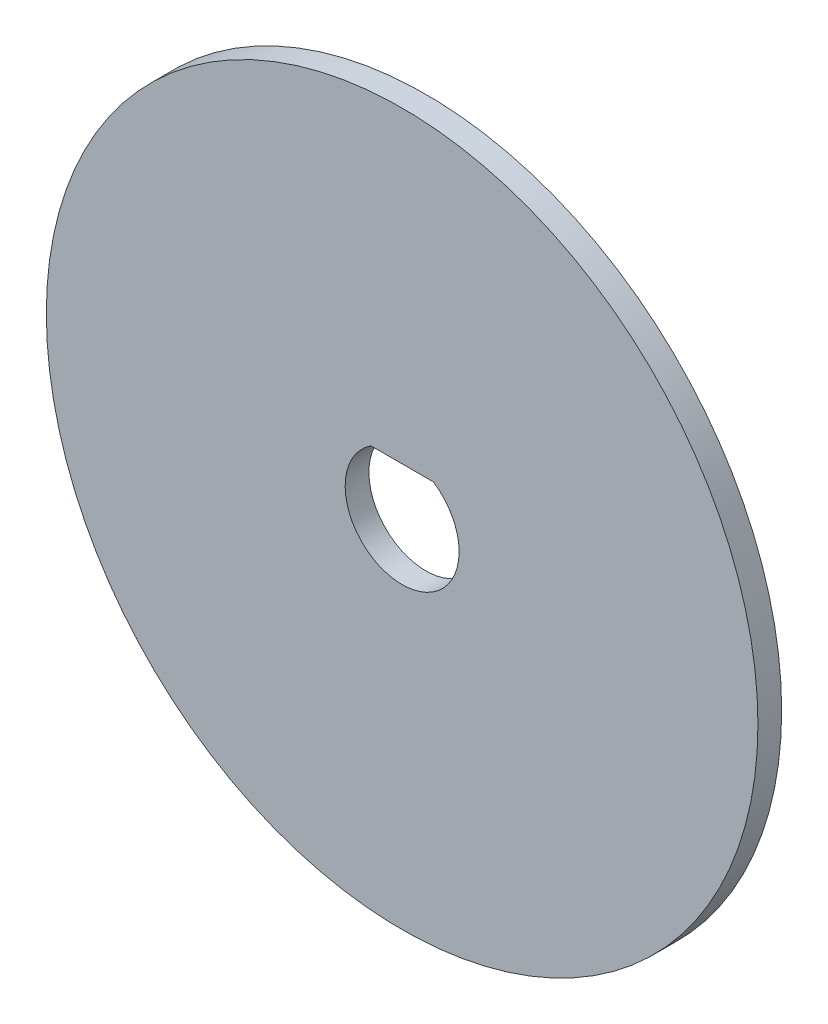
ISO-10303-21;
HEADER;
FILE_DESCRIPTION(('STEP AP214'),'2;1');
FILE_NAME('part.step','',(''),(''),'','','');
FILE_SCHEMA(('AUTOMOTIVE_DESIGN { 1 0 10303 214 1 1 1 1 }'));
ENDSEC;
DATA;
#1=APPLICATION_CONTEXT('core data for automotive mechanical design processes');
#2=APPLICATION_PROTOCOL_DEFINITION('international standard','automotive_design',2000,#1);
#3=PRODUCT_CONTEXT('',#1,'mechanical');
#4=PRODUCT('Part','Part','',(#3));
#5=PRODUCT_RELATED_PRODUCT_CATEGORY('part','',(#4));
#6=PRODUCT_DEFINITION_FORMATION('','',#4);
#7=PRODUCT_DEFINITION_CONTEXT('part definition',#1,'design');
#8=PRODUCT_DEFINITION('design','',#6,#7);
#9=PRODUCT_DEFINITION_SHAPE('','',#8);
#10=(LENGTH_UNIT() NAMED_UNIT(*) SI_UNIT(.MILLI.,.METRE.));
#11=(NAMED_UNIT(*) PLANE_ANGLE_UNIT() SI_UNIT($,.RADIAN.));
#12=(NAMED_UNIT(*) SI_UNIT($,.STERADIAN.) SOLID_ANGLE_UNIT());
#13=UNCERTAINTY_MEASURE_WITH_UNIT(LENGTH_MEASURE(1.E-05),#10,'distance_accuracy_value','');
#14=(GEOMETRIC_REPRESENTATION_CONTEXT(3) GLOBAL_UNCERTAINTY_ASSIGNED_CONTEXT((#13)) GLOBAL_UNIT_ASSIGNED_CONTEXT((#10,
#11,#12)) REPRESENTATION_CONTEXT('',''));
#15=CARTESIAN_POINT('',(0.,0.,0.));
#16=DIRECTION('',(0.,0.,1.));
#17=DIRECTION('',(1.,0.,0.));
#18=AXIS2_PLACEMENT_3D('',#15,#16,#17);
#19=CARTESIAN_POINT('',(0.,0.,1.27));
#20=DIRECTION('',(0.,0.,1.));
#21=DIRECTION('',(1.,0.,0.));
#22=AXIS2_PLACEMENT_3D('',#19,#20,#21);
#23=PLANE('',#22);
#24=CARTESIAN_POINT('',(0.,0.,1.27));
#25=DIRECTION('',(0.,0.,1.));
#26=DIRECTION('',(1.,0.,0.));
#27=AXIS2_PLACEMENT_3D('',#24,#25,#26);
#28=CIRCLE('',#27,19.05);
#29=CARTESIAN_POINT('',(19.05,0.,1.27));
#30=VERTEX_POINT('',#29);
#31=EDGE_CURVE('E320',#30,#30,#28,.T.);
#32=ORIENTED_EDGE('',*,*,#31,.T.);
#33=EDGE_LOOP('',(#32));
#34=FACE_BOUND('',#33,.T.);
#35=CARTESIAN_POINT('',(0.,0.,1.27));
#36=DIRECTION('',(0.,0.,1.));
#37=DIRECTION('',(1.,0.,0.));
#38=AXIS2_PLACEMENT_3D('',#35,#36,#37);
#39=CIRCLE('',#38,3.05);
#40=CARTESIAN_POINT('',(-1.67332005306815,2.55,1.27));
#41=VERTEX_POINT('',#40);
#42=CARTESIAN_POINT('',(1.67332005306815,2.55,1.27));
#43=VERTEX_POINT('',#42);
#44=EDGE_CURVE('E315',#41,#43,#39,.T.);
#45=ORIENTED_EDGE('',*,*,#44,.F.);
#46=DIRECTION('',(1.,0.,0.));
#47=VECTOR('',#46,1.);
#48=CARTESIAN_POINT('',(-1.67332005306815,2.55,1.27));
#49=LINE('',#48,#47);
#50=EDGE_CURVE('E183',#41,#43,#49,.T.);
#51=ORIENTED_EDGE('',*,*,#50,.T.);
#52=EDGE_LOOP('',(#45,#51));
#53=FACE_BOUND('',#52,.T.);
#54=ADVANCED_FACE('F39',(#34,#53),#23,.T.);
#55=CARTESIAN_POINT('',(0.,0.,0.));
#56=DIRECTION('',(0.,0.,1.));
#57=DIRECTION('',(1.,0.,0.));
#58=AXIS2_PLACEMENT_3D('',#55,#56,#57);
#59=PLANE('',#58);
#60=DIRECTION('',(-1.,0.,0.));
#61=VECTOR('',#60,1.);
#62=CARTESIAN_POINT('',(-6.31881503147545,1.52399999999998,0.));
#63=LINE('',#62,#61);
#64=CARTESIAN_POINT('',(-6.31881503147545,1.52399999999998,0.));
#65=VERTEX_POINT('',#64);
#66=CARTESIAN_POINT('',(-7.58881503147545,1.52399999999997,0.));
#67=VERTEX_POINT('',#66);
#68=EDGE_CURVE('E196',#65,#67,#63,.T.);
#69=ORIENTED_EDGE('',*,*,#68,.T.);
#70=DIRECTION('',(0.,-1.,0.));
#71=VECTOR('',#70,1.);
#72=CARTESIAN_POINT('',(-7.58881503147545,1.52399999999997,0.));
#73=LINE('',#72,#71);
#74=CARTESIAN_POINT('',(-7.58881503147544,-1.52400000000003,0.));
#75=VERTEX_POINT('',#74);
#76=EDGE_CURVE('E205',#67,#75,#73,.T.);
#77=ORIENTED_EDGE('',*,*,#76,.T.);
#78=DIRECTION('',(1.,0.,0.));
#79=VECTOR('',#78,1.);
#80=CARTESIAN_POINT('',(-7.58881503147544,-1.52400000000003,0.));
#81=LINE('',#80,#79);
#82=CARTESIAN_POINT('',(-6.31881503147544,-1.52400000000002,0.));
#83=VERTEX_POINT('',#82);
#84=EDGE_CURVE('E208',#75,#83,#81,.T.);
#85=ORIENTED_EDGE('',*,*,#84,.T.);
#86=CARTESIAN_POINT('',(0.,0.,0.));
#87=DIRECTION('',(0.,0.,1.));
#88=DIRECTION('',(0.,1.,0.));
#89=AXIS2_PLACEMENT_3D('',#86,#87,#88);
#90=CIRCLE('',#89,6.499999954);
#91=EDGE_CURVE('E212',#65,#83,#90,.T.);
#92=ORIENTED_EDGE('',*,*,#91,.F.);
#93=EDGE_LOOP('',(#69,#77,#85,#92));
#94=FACE_BOUND('',#93,.T.);
#95=DIRECTION('',(0.,-1.,0.));
#96=VECTOR('',#95,1.);
#97=CARTESIAN_POINT('',(-1.524,-6.31881503147544,0.));
#98=LINE('',#97,#96);
#99=CARTESIAN_POINT('',(-1.524,-6.31881503147544,0.));
#100=VERTEX_POINT('',#99);
#101=CARTESIAN_POINT('',(-1.524,-7.58881503147544,0.));
#102=VERTEX_POINT('',#101);
#103=EDGE_CURVE('E229',#100,#102,#98,.T.);
#104=ORIENTED_EDGE('',*,*,#103,.T.);
#105=DIRECTION('',(1.,0.,0.));
#106=VECTOR('',#105,1.);
#107=CARTESIAN_POINT('',(-1.524,-7.58881503147544,0.));
#108=LINE('',#107,#106);
#109=CARTESIAN_POINT('',(1.524,-7.58881503147544,0.));
#110=VERTEX_POINT('',#109);
#111=EDGE_CURVE('E238',#102,#110,#108,.T.);
#112=ORIENTED_EDGE('',*,*,#111,.T.);
#113=DIRECTION('',(0.,1.,0.));
#114=VECTOR('',#113,1.);
#115=CARTESIAN_POINT('',(1.524,-7.58881503147544,0.));
#116=LINE('',#115,#114);
#117=CARTESIAN_POINT('',(1.524,-6.31881503147544,0.));
#118=VERTEX_POINT('',#117);
#119=EDGE_CURVE('E241',#110,#118,#116,.T.);
#120=ORIENTED_EDGE('',*,*,#119,.T.);
#121=CARTESIAN_POINT('',(0.,0.,0.));
#122=DIRECTION('',(0.,0.,1.));
#123=DIRECTION('',(-1.,0.,0.));
#124=AXIS2_PLACEMENT_3D('',#121,#122,#123);
#125=CIRCLE('',#124,6.499999954);
#126=EDGE_CURVE('E245',#100,#118,#125,.T.);
#127=ORIENTED_EDGE('',*,*,#126,.F.);
#128=EDGE_LOOP('',(#104,#112,#120,#127));
#129=FACE_BOUND('',#128,.T.);
#130=DIRECTION('',(1.,0.,0.));
#131=VECTOR('',#130,1.);
#132=CARTESIAN_POINT('',(6.31881503147546,-1.52399999999993,0.));
#133=LINE('',#132,#131);
#134=CARTESIAN_POINT('',(6.31881503147546,-1.52399999999993,0.));
#135=VERTEX_POINT('',#134);
#136=CARTESIAN_POINT('',(7.58881503147546,-1.52399999999992,0.));
#137=VERTEX_POINT('',#136);
#138=EDGE_CURVE('E260',#135,#137,#133,.T.);
#139=ORIENTED_EDGE('',*,*,#138,.T.);
#140=DIRECTION('',(0.,1.,0.));
#141=VECTOR('',#140,1.);
#142=CARTESIAN_POINT('',(7.58881503147546,-1.52399999999992,0.));
#143=LINE('',#142,#141);
#144=CARTESIAN_POINT('',(7.58881503147543,1.52400000000008,0.));
#145=VERTEX_POINT('',#144);
#146=EDGE_CURVE('E190',#137,#145,#143,.T.);
#147=ORIENTED_EDGE('',*,*,#146,.T.);
#148=DIRECTION('',(-1.,0.,0.));
#149=VECTOR('',#148,1.);
#150=CARTESIAN_POINT('',(7.58881503147543,1.52400000000008,0.));
#151=LINE('',#150,#149);
#152=CARTESIAN_POINT('',(6.31881503147543,1.52400000000007,0.));
#153=VERTEX_POINT('',#152);
#154=EDGE_CURVE('E271',#145,#153,#151,.T.);
#155=ORIENTED_EDGE('',*,*,#154,.T.);
#156=CARTESIAN_POINT('',(0.,0.,0.));
#157=DIRECTION('',(0.,0.,1.));
#158=DIRECTION('',(0.,-1.,0.));
#159=AXIS2_PLACEMENT_3D('',#156,#157,#158);
#160=CIRCLE('',#159,6.499999954);
#161=EDGE_CURVE('E274',#135,#153,#160,.T.);
#162=ORIENTED_EDGE('',*,*,#161,.F.);
#163=EDGE_LOOP('',(#139,#147,#155,#162));
#164=FACE_BOUND('',#163,.T.);
#165=DIRECTION('',(0.,1.,0.));
#166=VECTOR('',#165,1.);
#167=CARTESIAN_POINT('',(1.524,6.31881503147544,0.));
#168=LINE('',#167,#166);
#169=CARTESIAN_POINT('',(1.524,6.31881503147544,0.));
#170=VERTEX_POINT('',#169);
#171=CARTESIAN_POINT('',(1.524,7.58881503147544,0.));
#172=VERTEX_POINT('',#171);
#173=EDGE_CURVE('E289',#170,#172,#168,.T.);
#174=ORIENTED_EDGE('',*,*,#173,.T.);
#175=DIRECTION('',(-1.,0.,0.));
#176=VECTOR('',#175,1.);
#177=CARTESIAN_POINT('',(1.524,7.58881503147544,0.));
#178=LINE('',#177,#176);
#179=CARTESIAN_POINT('',(-1.524,7.58881503147544,0.));
#180=VERTEX_POINT('',#179);
#181=EDGE_CURVE('E218',#172,#180,#178,.T.);
#182=ORIENTED_EDGE('',*,*,#181,.T.);
#183=DIRECTION('',(0.,-1.,0.));
#184=VECTOR('',#183,1.);
#185=CARTESIAN_POINT('',(-1.524,7.58881503147544,0.));
#186=LINE('',#185,#184);
#187=CARTESIAN_POINT('',(-1.524,6.31881503147544,0.));
#188=VERTEX_POINT('',#187);
#189=EDGE_CURVE('E300',#180,#188,#186,.T.);
#190=ORIENTED_EDGE('',*,*,#189,.T.);
#191=CARTESIAN_POINT('',(0.,0.,0.));
#192=DIRECTION('',(0.,0.,1.));
#193=DIRECTION('',(1.,0.,0.));
#194=AXIS2_PLACEMENT_3D('',#191,#192,#193);
#195=CIRCLE('',#194,6.499999954);
#196=EDGE_CURVE('E303',#170,#188,#195,.T.);
#197=ORIENTED_EDGE('',*,*,#196,.F.);
#198=EDGE_LOOP('',(#174,#182,#190,#197));
#199=FACE_BOUND('',#198,.T.);
#200=CARTESIAN_POINT('',(0.,0.,0.));
#201=DIRECTION('',(0.,0.,1.));
#202=DIRECTION('',(1.,0.,0.));
#203=AXIS2_PLACEMENT_3D('',#200,#201,#202);
#204=CIRCLE('',#203,19.05);
#205=CARTESIAN_POINT('',(19.05,0.,0.));
#206=VERTEX_POINT('',#205);
#207=EDGE_CURVE('E317',#206,#206,#204,.T.);
#208=ORIENTED_EDGE('',*,*,#207,.F.);
#209=EDGE_LOOP('',(#208));
#210=FACE_BOUND('',#209,.T.);
#211=CARTESIAN_POINT('',(0.,0.,0.));
#212=DIRECTION('',(0.,0.,1.));
#213=DIRECTION('',(1.,0.,0.));
#214=AXIS2_PLACEMENT_3D('',#211,#212,#213);
#215=CIRCLE('',#214,3.05);
#216=CARTESIAN_POINT('',(1.67332005306815,2.55,0.));
#217=VERTEX_POINT('',#216);
#218=CARTESIAN_POINT('',(-1.67332005306815,2.55,0.));
#219=VERTEX_POINT('',#218);
#220=EDGE_CURVE('E318',#217,#219,#215,.T.);
#221=ORIENTED_EDGE('',*,*,#220,.T.);
#222=EDGE_CURVE('E54',#219,#217,#215,.T.);
#223=ORIENTED_EDGE('',*,*,#222,.T.);
#224=EDGE_LOOP('',(#221,#223));
#225=FACE_BOUND('',#224,.T.);
#226=ADVANCED_FACE('F338',(#94,#129,#164,#199,#210,#225),#59,.F.);
#227=CARTESIAN_POINT('',(0.,0.,1.27));
#228=DIRECTION('',(0.,0.,-1.));
#229=DIRECTION('',(-1.,0.,0.));
#230=AXIS2_PLACEMENT_3D('',#227,#228,#229);
#231=CYLINDRICAL_SURFACE('',#230,19.05);
#232=ORIENTED_EDGE('',*,*,#31,.F.);
#233=EDGE_LOOP('',(#232));
#234=FACE_BOUND('',#233,.T.);
#235=ORIENTED_EDGE('',*,*,#207,.T.);
#236=EDGE_LOOP('',(#235));
#237=FACE_BOUND('',#236,.T.);
#238=ADVANCED_FACE('F41',(#234,#237),#231,.T.);
#239=CARTESIAN_POINT('',(0.,0.,1.27));
#240=DIRECTION('',(0.,0.,-1.));
#241=DIRECTION('',(-1.,0.,0.));
#242=AXIS2_PLACEMENT_3D('',#239,#240,#241);
#243=CYLINDRICAL_SURFACE('',#242,3.05);
#244=DIRECTION('',(0.,0.,-1.));
#245=VECTOR('',#244,1.);
#246=CARTESIAN_POINT('',(-1.67332005306815,2.55,1.27));
#247=LINE('',#246,#245);
#248=EDGE_CURVE('E11',#41,#219,#247,.T.);
#249=ORIENTED_EDGE('',*,*,#248,.F.);
#250=ORIENTED_EDGE('',*,*,#44,.T.);
#251=DIRECTION('',(0.,0.,-1.));
#252=VECTOR('',#251,1.);
#253=CARTESIAN_POINT('',(1.67332005306815,2.55,1.27));
#254=LINE('',#253,#252);
#255=EDGE_CURVE('E47',#217,#43,#254,.F.);
#256=ORIENTED_EDGE('',*,*,#255,.F.);
#257=ORIENTED_EDGE('',*,*,#222,.F.);
#258=EDGE_LOOP('',(#249,#250,#256,#257));
#259=FACE_BOUND('',#258,.T.);
#260=ADVANCED_FACE('F325',(#259),#243,.F.);
#261=CARTESIAN_POINT('',(1.524,7.58881503147544,-1.27));
#262=DIRECTION('',(0.,1.,0.));
#263=DIRECTION('',(0.,0.,1.));
#264=AXIS2_PLACEMENT_3D('',#261,#262,#263);
#265=PLANE('',#264);
#266=ORIENTED_EDGE('',*,*,#181,.F.);
#267=DIRECTION('',(0.,0.,1.));
#268=VECTOR('',#267,1.);
#269=CARTESIAN_POINT('',(1.524,7.58881503147544,-1.27));
#270=LINE('',#269,#268);
#271=CARTESIAN_POINT('',(1.524,7.58881503147544,-1.27));
#272=VERTEX_POINT('',#271);
#273=EDGE_CURVE('E307',#272,#172,#270,.T.);
#274=ORIENTED_EDGE('',*,*,#273,.F.);
#275=DIRECTION('',(-1.,0.,0.));
#276=VECTOR('',#275,1.);
#277=CARTESIAN_POINT('',(1.524,7.58881503147544,-1.27));
#278=LINE('',#277,#276);
#279=CARTESIAN_POINT('',(-1.524,7.58881503147544,-1.27));
#280=VERTEX_POINT('',#279);
#281=EDGE_CURVE('E285',#272,#280,#278,.T.);
#282=ORIENTED_EDGE('',*,*,#281,.T.);
#283=DIRECTION('',(0.,0.,1.));
#284=VECTOR('',#283,1.);
#285=CARTESIAN_POINT('',(-1.524,7.58881503147544,-1.27));
#286=LINE('',#285,#284);
#287=EDGE_CURVE('E297',#280,#180,#286,.T.);
#288=ORIENTED_EDGE('',*,*,#287,.T.);
#289=EDGE_LOOP('',(#266,#274,#282,#288));
#290=FACE_BOUND('',#289,.T.);
#291=ADVANCED_FACE('F327',(#290),#265,.T.);
#292=CARTESIAN_POINT('',(1.524,6.31881503147544,-1.27));
#293=DIRECTION('',(1.,0.,0.));
#294=DIRECTION('',(0.,0.,-1.));
#295=AXIS2_PLACEMENT_3D('',#292,#293,#294);
#296=PLANE('',#295);
#297=ORIENTED_EDGE('',*,*,#173,.F.);
#298=DIRECTION('',(0.,0.,1.));
#299=VECTOR('',#298,1.);
#300=CARTESIAN_POINT('',(1.524,6.31881503147544,-1.27));
#301=LINE('',#300,#299);
#302=CARTESIAN_POINT('',(1.524,6.31881503147544,-1.27));
#303=VERTEX_POINT('',#302);
#304=EDGE_CURVE('E309',#303,#170,#301,.T.);
#305=ORIENTED_EDGE('',*,*,#304,.F.);
#306=DIRECTION('',(0.,1.,0.));
#307=VECTOR('',#306,1.);
#308=CARTESIAN_POINT('',(1.524,6.31881503147544,-1.27));
#309=LINE('',#308,#307);
#310=EDGE_CURVE('E294',#303,#272,#309,.T.);
#311=ORIENTED_EDGE('',*,*,#310,.T.);
#312=ORIENTED_EDGE('',*,*,#273,.T.);
#313=EDGE_LOOP('',(#297,#305,#311,#312));
#314=FACE_BOUND('',#313,.T.);
#315=ADVANCED_FACE('F334',(#314),#296,.T.);
#316=CARTESIAN_POINT('',(0.,0.,-1.27));
#317=DIRECTION('',(0.,0.,1.));
#318=DIRECTION('',(1.,0.,0.));
#319=AXIS2_PLACEMENT_3D('',#316,#317,#318);
#320=CYLINDRICAL_SURFACE('',#319,6.499999954);
#321=ORIENTED_EDGE('',*,*,#196,.T.);
#322=DIRECTION('',(0.,0.,1.));
#323=VECTOR('',#322,1.);
#324=CARTESIAN_POINT('',(-1.524,6.31881503147544,-1.27));
#325=LINE('',#324,#323);
#326=CARTESIAN_POINT('',(-1.524,6.31881503147544,-1.27));
#327=VERTEX_POINT('',#326);
#328=EDGE_CURVE('E311',#327,#188,#325,.T.);
#329=ORIENTED_EDGE('',*,*,#328,.F.);
#330=CARTESIAN_POINT('',(0.,0.,-1.27));
#331=DIRECTION('',(0.,0.,1.));
#332=DIRECTION('',(1.,0.,0.));
#333=AXIS2_PLACEMENT_3D('',#330,#331,#332);
#334=CIRCLE('',#333,6.499999954);
#335=EDGE_CURVE('E292',#303,#327,#334,.T.);
#336=ORIENTED_EDGE('',*,*,#335,.F.);
#337=ORIENTED_EDGE('',*,*,#304,.T.);
#338=EDGE_LOOP('',(#321,#329,#336,#337));
#339=FACE_BOUND('',#338,.T.);
#340=ADVANCED_FACE('F376',(#339),#320,.F.);
#341=CARTESIAN_POINT('',(-1.524,7.58881503147544,-1.27));
#342=DIRECTION('',(-1.,0.,0.));
#343=DIRECTION('',(0.,0.,1.));
#344=AXIS2_PLACEMENT_3D('',#341,#342,#343);
#345=PLANE('',#344);
#346=ORIENTED_EDGE('',*,*,#189,.F.);
#347=ORIENTED_EDGE('',*,*,#287,.F.);
#348=DIRECTION('',(0.,-1.,0.));
#349=VECTOR('',#348,1.);
#350=CARTESIAN_POINT('',(-1.524,7.58881503147544,-1.27));
#351=LINE('',#350,#349);
#352=EDGE_CURVE('E288',#280,#327,#351,.T.);
#353=ORIENTED_EDGE('',*,*,#352,.T.);
#354=ORIENTED_EDGE('',*,*,#328,.T.);
#355=EDGE_LOOP('',(#346,#347,#353,#354));
#356=FACE_BOUND('',#355,.T.);
#357=ADVANCED_FACE('F373',(#356),#345,.T.);
#358=CARTESIAN_POINT('',(0.,0.,-1.27));
#359=DIRECTION('',(0.,0.,1.));
#360=DIRECTION('',(1.,0.,0.));
#361=AXIS2_PLACEMENT_3D('',#358,#359,#360);
#362=PLANE('',#361);
#363=ORIENTED_EDGE('',*,*,#281,.F.);
#364=ORIENTED_EDGE('',*,*,#310,.F.);
#365=ORIENTED_EDGE('',*,*,#335,.T.);
#366=ORIENTED_EDGE('',*,*,#352,.F.);
#367=EDGE_LOOP('',(#363,#364,#365,#366));
#368=FACE_BOUND('',#367,.T.);
#369=ADVANCED_FACE('F378',(#368),#362,.F.);
#370=CARTESIAN_POINT('',(7.58881503147546,-1.52399999999992,-1.27));
#371=DIRECTION('',(1.,0.,0.));
#372=DIRECTION('',(0.,1.,0.));
#373=AXIS2_PLACEMENT_3D('',#370,#371,#372);
#374=PLANE('',#373);
#375=ORIENTED_EDGE('',*,*,#146,.F.);
#376=DIRECTION('',(0.,0.,1.));
#377=VECTOR('',#376,1.);
#378=CARTESIAN_POINT('',(7.58881503147546,-1.52399999999992,-1.27));
#379=LINE('',#378,#377);
#380=CARTESIAN_POINT('',(7.58881503147546,-1.52399999999992,-1.27));
#381=VERTEX_POINT('',#380);
#382=EDGE_CURVE('E242',#381,#137,#379,.T.);
#383=ORIENTED_EDGE('',*,*,#382,.F.);
#384=DIRECTION('',(0.,1.,0.));
#385=VECTOR('',#384,1.);
#386=CARTESIAN_POINT('',(7.58881503147546,-1.52399999999992,-1.27));
#387=LINE('',#386,#385);
#388=CARTESIAN_POINT('',(7.58881503147543,1.52400000000008,-1.27));
#389=VERTEX_POINT('',#388);
#390=EDGE_CURVE('E256',#381,#389,#387,.T.);
#391=ORIENTED_EDGE('',*,*,#390,.T.);
#392=DIRECTION('',(0.,0.,1.));
#393=VECTOR('',#392,1.);
#394=CARTESIAN_POINT('',(7.58881503147543,1.52400000000008,-1.27));
#395=LINE('',#394,#393);
#396=EDGE_CURVE('E268',#389,#145,#395,.T.);
#397=ORIENTED_EDGE('',*,*,#396,.T.);
#398=EDGE_LOOP('',(#375,#383,#391,#397));
#399=FACE_BOUND('',#398,.T.);
#400=ADVANCED_FACE('F380',(#399),#374,.T.);
#401=CARTESIAN_POINT('',(6.31881503147546,-1.52399999999993,-1.27));
#402=DIRECTION('',(0.,-1.,0.));
#403=DIRECTION('',(1.,0.,0.));
#404=AXIS2_PLACEMENT_3D('',#401,#402,#403);
#405=PLANE('',#404);
#406=ORIENTED_EDGE('',*,*,#138,.F.);
#407=DIRECTION('',(0.,0.,1.));
#408=VECTOR('',#407,1.);
#409=CARTESIAN_POINT('',(6.31881503147546,-1.52399999999993,-1.27));
#410=LINE('',#409,#408);
#411=CARTESIAN_POINT('',(6.31881503147546,-1.52399999999993,-1.27));
#412=VERTEX_POINT('',#411);
#413=EDGE_CURVE('E279',#412,#135,#410,.T.);
#414=ORIENTED_EDGE('',*,*,#413,.F.);
#415=DIRECTION('',(1.,0.,0.));
#416=VECTOR('',#415,1.);
#417=CARTESIAN_POINT('',(6.31881503147546,-1.52399999999993,-1.27));
#418=LINE('',#417,#416);
#419=EDGE_CURVE('E265',#412,#381,#418,.T.);
#420=ORIENTED_EDGE('',*,*,#419,.T.);
#421=ORIENTED_EDGE('',*,*,#382,.T.);
#422=EDGE_LOOP('',(#406,#414,#420,#421));
#423=FACE_BOUND('',#422,.T.);
#424=ADVANCED_FACE('F386',(#423),#405,.T.);
#425=CARTESIAN_POINT('',(0.,0.,-1.27));
#426=DIRECTION('',(0.,0.,1.));
#427=DIRECTION('',(1.,0.,0.));
#428=AXIS2_PLACEMENT_3D('',#425,#426,#427);
#429=CYLINDRICAL_SURFACE('',#428,6.499999954);
#430=ORIENTED_EDGE('',*,*,#161,.T.);
#431=DIRECTION('',(0.,0.,1.));
#432=VECTOR('',#431,1.);
#433=CARTESIAN_POINT('',(6.31881503147543,1.52400000000007,-1.27));
#434=LINE('',#433,#432);
#435=CARTESIAN_POINT('',(6.31881503147543,1.52400000000007,-1.27));
#436=VERTEX_POINT('',#435);
#437=EDGE_CURVE('E281',#436,#153,#434,.T.);
#438=ORIENTED_EDGE('',*,*,#437,.F.);
#439=CARTESIAN_POINT('',(0.,0.,-1.27));
#440=DIRECTION('',(0.,0.,1.));
#441=DIRECTION('',(0.,-1.,0.));
#442=AXIS2_PLACEMENT_3D('',#439,#440,#441);
#443=CIRCLE('',#442,6.499999954);
#444=EDGE_CURVE('E263',#412,#436,#443,.T.);
#445=ORIENTED_EDGE('',*,*,#444,.F.);
#446=ORIENTED_EDGE('',*,*,#413,.T.);
#447=EDGE_LOOP('',(#430,#438,#445,#446));
#448=FACE_BOUND('',#447,.T.);
#449=ADVANCED_FACE('F424',(#448),#429,.F.);
#450=CARTESIAN_POINT('',(7.58881503147543,1.52400000000008,-1.27));
#451=DIRECTION('',(0.,1.,0.));
#452=DIRECTION('',(-1.,0.,0.));
#453=AXIS2_PLACEMENT_3D('',#450,#451,#452);
#454=PLANE('',#453);
#455=ORIENTED_EDGE('',*,*,#154,.F.);
#456=ORIENTED_EDGE('',*,*,#396,.F.);
#457=DIRECTION('',(-1.,0.,0.));
#458=VECTOR('',#457,1.);
#459=CARTESIAN_POINT('',(7.58881503147543,1.52400000000008,-1.27));
#460=LINE('',#459,#458);
#461=EDGE_CURVE('E259',#389,#436,#460,.T.);
#462=ORIENTED_EDGE('',*,*,#461,.T.);
#463=ORIENTED_EDGE('',*,*,#437,.T.);
#464=EDGE_LOOP('',(#455,#456,#462,#463));
#465=FACE_BOUND('',#464,.T.);
#466=ADVANCED_FACE('F434',(#465),#454,.T.);
#467=CARTESIAN_POINT('',(0.,0.,-1.27));
#468=DIRECTION('',(0.,0.,1.));
#469=DIRECTION('',(0.,-1.,0.));
#470=AXIS2_PLACEMENT_3D('',#467,#468,#469);
#471=PLANE('',#470);
#472=ORIENTED_EDGE('',*,*,#390,.F.);
#473=ORIENTED_EDGE('',*,*,#419,.F.);
#474=ORIENTED_EDGE('',*,*,#444,.T.);
#475=ORIENTED_EDGE('',*,*,#461,.F.);
#476=EDGE_LOOP('',(#472,#473,#474,#475));
#477=FACE_BOUND('',#476,.T.);
#478=ADVANCED_FACE('F444',(#477),#471,.F.);
#479=CARTESIAN_POINT('',(-1.524,-7.58881503147544,-1.27));
#480=DIRECTION('',(0.,-1.,0.));
#481=DIRECTION('',(0.,0.,-1.));
#482=AXIS2_PLACEMENT_3D('',#479,#480,#481);
#483=PLANE('',#482);
#484=ORIENTED_EDGE('',*,*,#111,.F.);
#485=DIRECTION('',(0.,0.,1.));
#486=VECTOR('',#485,1.);
#487=CARTESIAN_POINT('',(-1.524,-7.58881503147544,-1.27));
#488=LINE('',#487,#486);
#489=CARTESIAN_POINT('',(-1.524,-7.58881503147544,-1.27));
#490=VERTEX_POINT('',#489);
#491=EDGE_CURVE('E209',#490,#102,#488,.T.);
#492=ORIENTED_EDGE('',*,*,#491,.F.);
#493=DIRECTION('',(1.,0.,0.));
#494=VECTOR('',#493,1.);
#495=CARTESIAN_POINT('',(-1.524,-7.58881503147544,-1.27));
#496=LINE('',#495,#494);
#497=CARTESIAN_POINT('',(1.524,-7.58881503147544,-1.27));
#498=VERTEX_POINT('',#497);
#499=EDGE_CURVE('E225',#490,#498,#496,.T.);
#500=ORIENTED_EDGE('',*,*,#499,.T.);
#501=DIRECTION('',(0.,0.,1.));
#502=VECTOR('',#501,1.);
#503=CARTESIAN_POINT('',(1.524,-7.58881503147544,-1.27));
#504=LINE('',#503,#502);
#505=EDGE_CURVE('E237',#498,#110,#504,.T.);
#506=ORIENTED_EDGE('',*,*,#505,.T.);
#507=EDGE_LOOP('',(#484,#492,#500,#506));
#508=FACE_BOUND('',#507,.T.);
#509=ADVANCED_FACE('F453',(#508),#483,.T.);
#510=CARTESIAN_POINT('',(-1.524,-6.31881503147544,-1.27));
#511=DIRECTION('',(-1.,0.,0.));
#512=DIRECTION('',(0.,0.,1.));
#513=AXIS2_PLACEMENT_3D('',#510,#511,#512);
#514=PLANE('',#513);
#515=ORIENTED_EDGE('',*,*,#103,.F.);
#516=DIRECTION('',(0.,0.,1.));
#517=VECTOR('',#516,1.);
#518=CARTESIAN_POINT('',(-1.524,-6.31881503147544,-1.27));
#519=LINE('',#518,#517);
#520=CARTESIAN_POINT('',(-1.524,-6.31881503147544,-1.27));
#521=VERTEX_POINT('',#520);
#522=EDGE_CURVE('E250',#521,#100,#519,.T.);
#523=ORIENTED_EDGE('',*,*,#522,.F.);
#524=DIRECTION('',(0.,-1.,0.));
#525=VECTOR('',#524,1.);
#526=CARTESIAN_POINT('',(-1.524,-6.31881503147544,-1.27));
#527=LINE('',#526,#525);
#528=EDGE_CURVE('E234',#521,#490,#527,.T.);
#529=ORIENTED_EDGE('',*,*,#528,.T.);
#530=ORIENTED_EDGE('',*,*,#491,.T.);
#531=EDGE_LOOP('',(#515,#523,#529,#530));
#532=FACE_BOUND('',#531,.T.);
#533=ADVANCED_FACE('F463',(#532),#514,.T.);
#534=CARTESIAN_POINT('',(0.,0.,-1.27));
#535=DIRECTION('',(0.,0.,1.));
#536=DIRECTION('',(1.,0.,0.));
#537=AXIS2_PLACEMENT_3D('',#534,#535,#536);
#538=CYLINDRICAL_SURFACE('',#537,6.499999954);
#539=ORIENTED_EDGE('',*,*,#126,.T.);
#540=DIRECTION('',(0.,0.,1.));
#541=VECTOR('',#540,1.);
#542=CARTESIAN_POINT('',(1.524,-6.31881503147544,-1.27));
#543=LINE('',#542,#541);
#544=CARTESIAN_POINT('',(1.524,-6.31881503147544,-1.27));
#545=VERTEX_POINT('',#544);
#546=EDGE_CURVE('E252',#545,#118,#543,.T.);
#547=ORIENTED_EDGE('',*,*,#546,.F.);
#548=CARTESIAN_POINT('',(0.,0.,-1.27));
#549=DIRECTION('',(0.,0.,1.));
#550=DIRECTION('',(-1.,0.,0.));
#551=AXIS2_PLACEMENT_3D('',#548,#549,#550);
#552=CIRCLE('',#551,6.499999954);
#553=EDGE_CURVE('E232',#521,#545,#552,.T.);
#554=ORIENTED_EDGE('',*,*,#553,.F.);
#555=ORIENTED_EDGE('',*,*,#522,.T.);
#556=EDGE_LOOP('',(#539,#547,#554,#555));
#557=FACE_BOUND('',#556,.T.);
#558=ADVANCED_FACE('F473',(#557),#538,.F.);
#559=CARTESIAN_POINT('',(1.524,-7.58881503147544,-1.27));
#560=DIRECTION('',(1.,0.,0.));
#561=DIRECTION('',(0.,0.,-1.));
#562=AXIS2_PLACEMENT_3D('',#559,#560,#561);
#563=PLANE('',#562);
#564=ORIENTED_EDGE('',*,*,#119,.F.);
#565=ORIENTED_EDGE('',*,*,#505,.F.);
#566=DIRECTION('',(0.,1.,0.));
#567=VECTOR('',#566,1.);
#568=CARTESIAN_POINT('',(1.524,-7.58881503147544,-1.27));
#569=LINE('',#568,#567);
#570=EDGE_CURVE('E228',#498,#545,#569,.T.);
#571=ORIENTED_EDGE('',*,*,#570,.T.);
#572=ORIENTED_EDGE('',*,*,#546,.T.);
#573=EDGE_LOOP('',(#564,#565,#571,#572));
#574=FACE_BOUND('',#573,.T.);
#575=ADVANCED_FACE('F483',(#574),#563,.T.);
#576=CARTESIAN_POINT('',(0.,0.,-1.27));
#577=DIRECTION('',(0.,0.,1.));
#578=DIRECTION('',(-1.,0.,0.));
#579=AXIS2_PLACEMENT_3D('',#576,#577,#578);
#580=PLANE('',#579);
#581=ORIENTED_EDGE('',*,*,#499,.F.);
#582=ORIENTED_EDGE('',*,*,#528,.F.);
#583=ORIENTED_EDGE('',*,*,#553,.T.);
#584=ORIENTED_EDGE('',*,*,#570,.F.);
#585=EDGE_LOOP('',(#581,#582,#583,#584));
#586=FACE_BOUND('',#585,.T.);
#587=ADVANCED_FACE('F493',(#586),#580,.F.);
#588=CARTESIAN_POINT('',(-7.58881503147545,1.52399999999997,-1.27));
#589=DIRECTION('',(-1.,0.,0.));
#590=DIRECTION('',(0.,-1.,0.));
#591=AXIS2_PLACEMENT_3D('',#588,#589,#590);
#592=PLANE('',#591);
#593=ORIENTED_EDGE('',*,*,#76,.F.);
#594=DIRECTION('',(0.,0.,1.));
#595=VECTOR('',#594,1.);
#596=CARTESIAN_POINT('',(-7.58881503147545,1.52399999999997,-1.27));
#597=LINE('',#596,#595);
#598=CARTESIAN_POINT('',(-7.58881503147545,1.52399999999997,-1.27));
#599=VERTEX_POINT('',#598);
#600=EDGE_CURVE('E216',#599,#67,#597,.T.);
#601=ORIENTED_EDGE('',*,*,#600,.F.);
#602=DIRECTION('',(0.,-1.,0.));
#603=VECTOR('',#602,1.);
#604=CARTESIAN_POINT('',(-7.58881503147545,1.52399999999997,-1.27));
#605=LINE('',#604,#603);
#606=CARTESIAN_POINT('',(-7.58881503147544,-1.52400000000003,-1.27));
#607=VERTEX_POINT('',#606);
#608=EDGE_CURVE('E192',#599,#607,#605,.T.);
#609=ORIENTED_EDGE('',*,*,#608,.T.);
#610=DIRECTION('',(0.,0.,1.));
#611=VECTOR('',#610,1.);
#612=CARTESIAN_POINT('',(-7.58881503147544,-1.52400000000003,-1.27));
#613=LINE('',#612,#611);
#614=EDGE_CURVE('E204',#607,#75,#613,.T.);
#615=ORIENTED_EDGE('',*,*,#614,.T.);
#616=EDGE_LOOP('',(#593,#601,#609,#615));
#617=FACE_BOUND('',#616,.T.);
#618=ADVANCED_FACE('F503',(#617),#592,.T.);
#619=CARTESIAN_POINT('',(-6.31881503147545,1.52399999999998,-1.27));
#620=DIRECTION('',(0.,1.,0.));
#621=DIRECTION('',(-1.,0.,0.));
#622=AXIS2_PLACEMENT_3D('',#619,#620,#621);
#623=PLANE('',#622);
#624=ORIENTED_EDGE('',*,*,#68,.F.);
#625=DIRECTION('',(0.,0.,1.));
#626=VECTOR('',#625,1.);
#627=CARTESIAN_POINT('',(-6.31881503147545,1.52399999999998,-1.27));
#628=LINE('',#627,#626);
#629=CARTESIAN_POINT('',(-6.31881503147545,1.52399999999998,-1.27));
#630=VERTEX_POINT('',#629);
#631=EDGE_CURVE('E219',#630,#65,#628,.T.);
#632=ORIENTED_EDGE('',*,*,#631,.F.);
#633=DIRECTION('',(-1.,0.,0.));
#634=VECTOR('',#633,1.);
#635=CARTESIAN_POINT('',(-6.31881503147545,1.52399999999998,-1.27));
#636=LINE('',#635,#634);
#637=EDGE_CURVE('E201',#630,#599,#636,.T.);
#638=ORIENTED_EDGE('',*,*,#637,.T.);
#639=ORIENTED_EDGE('',*,*,#600,.T.);
#640=EDGE_LOOP('',(#624,#632,#638,#639));
#641=FACE_BOUND('',#640,.T.);
#642=ADVANCED_FACE('F513',(#641),#623,.T.);
#643=CARTESIAN_POINT('',(0.,0.,-1.27));
#644=DIRECTION('',(0.,0.,1.));
#645=DIRECTION('',(1.,0.,0.));
#646=AXIS2_PLACEMENT_3D('',#643,#644,#645);
#647=CYLINDRICAL_SURFACE('',#646,6.499999954);
#648=ORIENTED_EDGE('',*,*,#91,.T.);
#649=DIRECTION('',(0.,0.,1.));
#650=VECTOR('',#649,1.);
#651=CARTESIAN_POINT('',(-6.31881503147544,-1.52400000000002,-1.27));
#652=LINE('',#651,#650);
#653=CARTESIAN_POINT('',(-6.31881503147544,-1.52400000000002,-1.27));
#654=VERTEX_POINT('',#653);
#655=EDGE_CURVE('E221',#654,#83,#652,.T.);
#656=ORIENTED_EDGE('',*,*,#655,.F.);
#657=CARTESIAN_POINT('',(0.,0.,-1.27));
#658=DIRECTION('',(0.,0.,1.));
#659=DIRECTION('',(0.,1.,0.));
#660=AXIS2_PLACEMENT_3D('',#657,#658,#659);
#661=CIRCLE('',#660,6.499999954);
#662=EDGE_CURVE('E199',#630,#654,#661,.T.);
#663=ORIENTED_EDGE('',*,*,#662,.F.);
#664=ORIENTED_EDGE('',*,*,#631,.T.);
#665=EDGE_LOOP('',(#648,#656,#663,#664));
#666=FACE_BOUND('',#665,.T.);
#667=ADVANCED_FACE('F523',(#666),#647,.F.);
#668=CARTESIAN_POINT('',(-7.58881503147544,-1.52400000000003,-1.27));
#669=DIRECTION('',(0.,-1.,0.));
#670=DIRECTION('',(1.,0.,0.));
#671=AXIS2_PLACEMENT_3D('',#668,#669,#670);
#672=PLANE('',#671);
#673=ORIENTED_EDGE('',*,*,#84,.F.);
#674=ORIENTED_EDGE('',*,*,#614,.F.);
#675=DIRECTION('',(1.,0.,0.));
#676=VECTOR('',#675,1.);
#677=CARTESIAN_POINT('',(-7.58881503147544,-1.52400000000003,-1.27));
#678=LINE('',#677,#676);
#679=EDGE_CURVE('E195',#607,#654,#678,.T.);
#680=ORIENTED_EDGE('',*,*,#679,.T.);
#681=ORIENTED_EDGE('',*,*,#655,.T.);
#682=EDGE_LOOP('',(#673,#674,#680,#681));
#683=FACE_BOUND('',#682,.T.);
#684=ADVANCED_FACE('F533',(#683),#672,.T.);
#685=CARTESIAN_POINT('',(0.,0.,-1.27));
#686=DIRECTION('',(0.,0.,1.));
#687=DIRECTION('',(0.,1.,0.));
#688=AXIS2_PLACEMENT_3D('',#685,#686,#687);
#689=PLANE('',#688);
#690=ORIENTED_EDGE('',*,*,#608,.F.);
#691=ORIENTED_EDGE('',*,*,#637,.F.);
#692=ORIENTED_EDGE('',*,*,#662,.T.);
#693=ORIENTED_EDGE('',*,*,#679,.F.);
#694=EDGE_LOOP('',(#690,#691,#692,#693));
#695=FACE_BOUND('',#694,.T.);
#696=ADVANCED_FACE('F543',(#695),#689,.F.);
#697=CARTESIAN_POINT('',(0.,0.,-1.27));
#698=DIRECTION('',(0.,0.,1.));
#699=DIRECTION('',(1.,0.,0.));
#700=AXIS2_PLACEMENT_3D('',#697,#698,#699);
#701=CYLINDRICAL_SURFACE('',#700,3.05);
#702=ORIENTED_EDGE('',*,*,#220,.F.);
#703=DIRECTION('',(0.,0.,1.));
#704=VECTOR('',#703,1.);
#705=CARTESIAN_POINT('',(1.67332005306815,2.55,-1.27));
#706=LINE('',#705,#704);
#707=CARTESIAN_POINT('',(1.67332005306815,2.55,-1.27));
#708=VERTEX_POINT('',#707);
#709=EDGE_CURVE('E177',#708,#217,#706,.T.);
#710=ORIENTED_EDGE('',*,*,#709,.F.);
#711=CARTESIAN_POINT('',(0.,0.,-1.27));
#712=DIRECTION('',(0.,0.,1.));
#713=DIRECTION('',(-1.,0.,0.));
#714=AXIS2_PLACEMENT_3D('',#711,#712,#713);
#715=CIRCLE('',#714,3.05);
#716=CARTESIAN_POINT('',(-1.67332005306815,2.55,-1.27));
#717=VERTEX_POINT('',#716);
#718=EDGE_CURVE('E180',#708,#717,#715,.T.);
#719=ORIENTED_EDGE('',*,*,#718,.T.);
#720=DIRECTION('',(0.,0.,1.));
#721=VECTOR('',#720,1.);
#722=CARTESIAN_POINT('',(-1.67332005306815,2.55,-1.27));
#723=LINE('',#722,#721);
#724=EDGE_CURVE('E168',#717,#219,#723,.T.);
#725=ORIENTED_EDGE('',*,*,#724,.T.);
#726=EDGE_LOOP('',(#702,#710,#719,#725));
#727=FACE_BOUND('',#726,.T.);
#728=ADVANCED_FACE('F181',(#727),#701,.T.);
#729=CARTESIAN_POINT('',(-1.67332005306815,2.55,-1.27));
#730=DIRECTION('',(0.,-1.,0.));
#731=DIRECTION('',(0.,0.,-1.));
#732=AXIS2_PLACEMENT_3D('',#729,#730,#731);
#733=PLANE('',#732);
#734=ORIENTED_EDGE('',*,*,#50,.F.);
#735=ORIENTED_EDGE('',*,*,#248,.T.);
#736=ORIENTED_EDGE('',*,*,#724,.F.);
#737=DIRECTION('',(1.,0.,0.));
#738=VECTOR('',#737,1.);
#739=CARTESIAN_POINT('',(-1.67332005306815,2.55,-1.27));
#740=LINE('',#739,#738);
#741=EDGE_CURVE('E174',#717,#708,#740,.T.);
#742=ORIENTED_EDGE('',*,*,#741,.T.);
#743=ORIENTED_EDGE('',*,*,#709,.T.);
#744=ORIENTED_EDGE('',*,*,#255,.T.);
#745=EDGE_LOOP('',(#734,#735,#736,#742,#743,#744));
#746=FACE_BOUND('',#745,.T.);
#747=ADVANCED_FACE('F171',(#746),#733,.T.);
#748=CARTESIAN_POINT('',(0.,0.,-1.27));
#749=DIRECTION('',(0.,0.,-1.));
#750=DIRECTION('',(-1.,0.,0.));
#751=AXIS2_PLACEMENT_3D('',#748,#749,#750);
#752=PLANE('',#751);
#753=ORIENTED_EDGE('',*,*,#718,.F.);
#754=ORIENTED_EDGE('',*,*,#741,.F.);
#755=EDGE_LOOP('',(#753,#754));
#756=FACE_BOUND('',#755,.T.);
#757=ADVANCED_FACE('F185',(#756),#752,.T.);
#758=CLOSED_SHELL('',(#54,#226,#238,#260,#291,#315,#340,#357,#369,#400,#424,#449,#466,#478,#509,
#533,#558,#575,#587,#618,#642,#667,#684,#696,#728,#747,#757));
#759=MANIFOLD_SOLID_BREP('B2',#758);
#760=ADVANCED_BREP_SHAPE_REPRESENTATION('',(#18,#759),#14);
#761=SHAPE_DEFINITION_REPRESENTATION(#9,#760);
ENDSEC;
END-ISO-10303-21;
